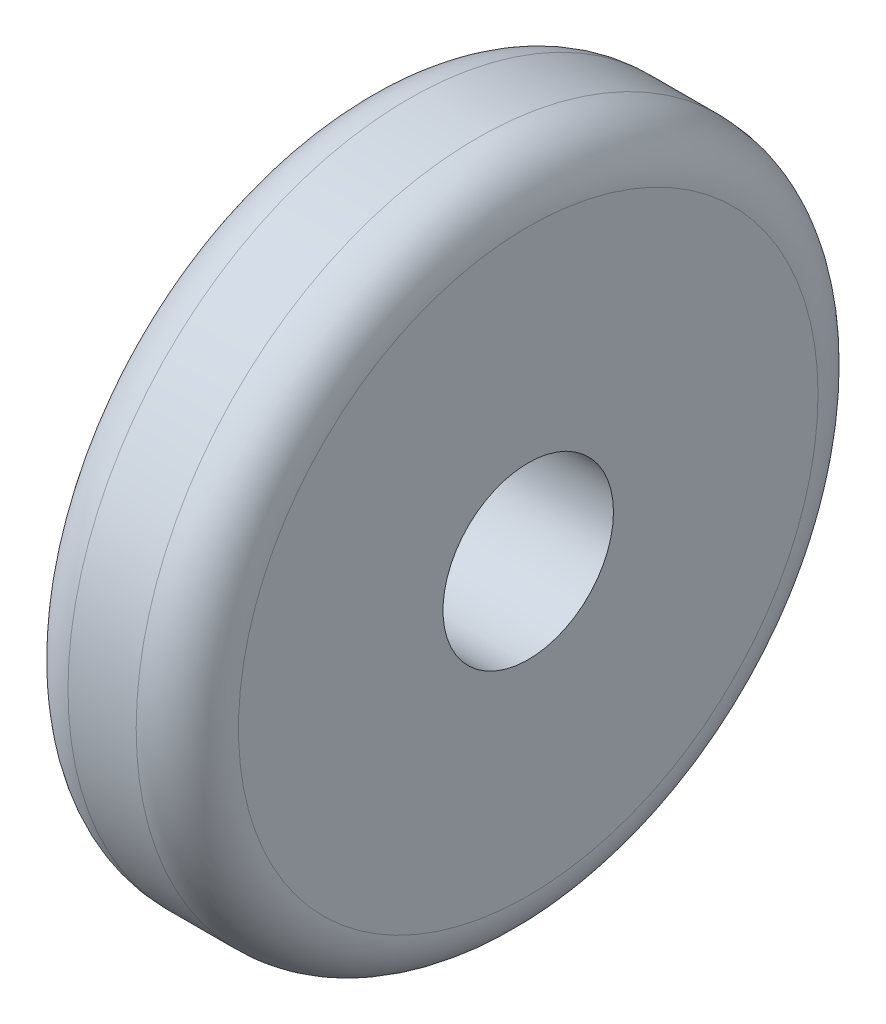
ISO-10303-21;
HEADER;
FILE_DESCRIPTION(('STEP AP214'),'2;1');
FILE_NAME('part.step','',(''),(''),'','','');
FILE_SCHEMA(('AUTOMOTIVE_DESIGN { 1 0 10303 214 1 1 1 1 }'));
ENDSEC;
DATA;
#1=APPLICATION_CONTEXT('core data for automotive mechanical design processes');
#2=APPLICATION_PROTOCOL_DEFINITION('international standard','automotive_design',2000,#1);
#3=PRODUCT_CONTEXT('',#1,'mechanical');
#4=PRODUCT('Part','Part','',(#3));
#5=PRODUCT_RELATED_PRODUCT_CATEGORY('part','',(#4));
#6=PRODUCT_DEFINITION_FORMATION('','',#4);
#7=PRODUCT_DEFINITION_CONTEXT('part definition',#1,'design');
#8=PRODUCT_DEFINITION('design','',#6,#7);
#9=PRODUCT_DEFINITION_SHAPE('','',#8);
#10=(LENGTH_UNIT() NAMED_UNIT(*) SI_UNIT(.MILLI.,.METRE.));
#11=(NAMED_UNIT(*) PLANE_ANGLE_UNIT() SI_UNIT($,.RADIAN.));
#12=(NAMED_UNIT(*) SI_UNIT($,.STERADIAN.) SOLID_ANGLE_UNIT());
#13=UNCERTAINTY_MEASURE_WITH_UNIT(LENGTH_MEASURE(1.E-05),#10,'distance_accuracy_value','');
#14=(GEOMETRIC_REPRESENTATION_CONTEXT(3) GLOBAL_UNCERTAINTY_ASSIGNED_CONTEXT((#13)) GLOBAL_UNIT_ASSIGNED_CONTEXT((#10,
#11,#12)) REPRESENTATION_CONTEXT('',''));
#15=CARTESIAN_POINT('',(0.,0.,0.));
#16=DIRECTION('',(0.,0.,1.));
#17=DIRECTION('',(1.,0.,0.));
#18=AXIS2_PLACEMENT_3D('',#15,#16,#17);
#19=CARTESIAN_POINT('',(5.,0.,0.));
#20=DIRECTION('',(1.,0.,0.));
#21=DIRECTION('',(0.,0.,-1.));
#22=AXIS2_PLACEMENT_3D('',#19,#20,#21);
#23=PLANE('',#22);
#24=CARTESIAN_POINT('',(5.,0.,0.));
#25=DIRECTION('',(1.,0.,0.));
#26=DIRECTION('',(0.,0.,-1.));
#27=AXIS2_PLACEMENT_3D('',#24,#25,#26);
#28=CIRCLE('',#27,17.);
#29=CARTESIAN_POINT('',(5.,0.,-17.));
#30=VERTEX_POINT('',#29);
#31=EDGE_CURVE('E10',#30,#30,#28,.T.);
#32=ORIENTED_EDGE('',*,*,#31,.T.);
#33=EDGE_LOOP('',(#32));
#34=FACE_BOUND('',#33,.T.);
#35=CARTESIAN_POINT('',(5.,0.,0.));
#36=DIRECTION('',(1.,0.,0.));
#37=DIRECTION('',(0.,0.,-1.));
#38=AXIS2_PLACEMENT_3D('',#35,#36,#37);
#39=CIRCLE('',#38,5.);
#40=CARTESIAN_POINT('',(5.,0.,-5.));
#41=VERTEX_POINT('',#40);
#42=EDGE_CURVE('E51',#41,#41,#39,.T.);
#43=ORIENTED_EDGE('',*,*,#42,.F.);
#44=EDGE_LOOP('',(#43));
#45=FACE_BOUND('',#44,.T.);
#46=ADVANCED_FACE('F31',(#34,#45),#23,.T.);
#47=CARTESIAN_POINT('',(-5.,0.,0.));
#48=DIRECTION('',(1.,0.,0.));
#49=DIRECTION('',(0.,0.,-1.));
#50=AXIS2_PLACEMENT_3D('',#47,#48,#49);
#51=PLANE('',#50);
#52=CARTESIAN_POINT('',(-5.,0.,0.));
#53=DIRECTION('',(1.,0.,0.));
#54=DIRECTION('',(0.,0.,-1.));
#55=AXIS2_PLACEMENT_3D('',#52,#53,#54);
#56=CIRCLE('',#55,17.);
#57=CARTESIAN_POINT('',(-5.,0.,-17.));
#58=VERTEX_POINT('',#57);
#59=EDGE_CURVE('E38',#58,#58,#56,.F.);
#60=ORIENTED_EDGE('',*,*,#59,.T.);
#61=EDGE_LOOP('',(#60));
#62=FACE_BOUND('',#61,.T.);
#63=CARTESIAN_POINT('',(-5.,0.,0.));
#64=DIRECTION('',(1.,0.,0.));
#65=DIRECTION('',(0.,0.,-1.));
#66=AXIS2_PLACEMENT_3D('',#63,#64,#65);
#67=CIRCLE('',#66,5.);
#68=CARTESIAN_POINT('',(-5.,0.,-5.));
#69=VERTEX_POINT('',#68);
#70=EDGE_CURVE('E52',#69,#69,#67,.T.);
#71=ORIENTED_EDGE('',*,*,#70,.T.);
#72=EDGE_LOOP('',(#71));
#73=FACE_BOUND('',#72,.T.);
#74=ADVANCED_FACE('F62',(#62,#73),#51,.F.);
#75=CARTESIAN_POINT('',(5.,0.,0.));
#76=DIRECTION('',(-1.,0.,0.));
#77=DIRECTION('',(0.,0.,1.));
#78=AXIS2_PLACEMENT_3D('',#75,#76,#77);
#79=CYLINDRICAL_SURFACE('',#78,20.);
#80=CARTESIAN_POINT('',(-2.,0.,0.));
#81=DIRECTION('',(1.,0.,0.));
#82=DIRECTION('',(0.,0.,-1.));
#83=AXIS2_PLACEMENT_3D('',#80,#81,#82);
#84=CIRCLE('',#83,20.);
#85=CARTESIAN_POINT('',(-2.,0.,-20.));
#86=VERTEX_POINT('',#85);
#87=EDGE_CURVE('E42',#86,#86,#84,.T.);
#88=ORIENTED_EDGE('',*,*,#87,.T.);
#89=EDGE_LOOP('',(#88));
#90=FACE_BOUND('',#89,.T.);
#91=CARTESIAN_POINT('',(2.,0.,0.));
#92=DIRECTION('',(1.,0.,0.));
#93=DIRECTION('',(0.,0.,-1.));
#94=AXIS2_PLACEMENT_3D('',#91,#92,#93);
#95=CIRCLE('',#94,20.);
#96=CARTESIAN_POINT('',(2.,0.,-20.));
#97=VERTEX_POINT('',#96);
#98=EDGE_CURVE('E46',#97,#97,#95,.F.);
#99=ORIENTED_EDGE('',*,*,#98,.T.);
#100=EDGE_LOOP('',(#99));
#101=FACE_BOUND('',#100,.T.);
#102=ADVANCED_FACE('F67',(#90,#101),#79,.T.);
#103=CARTESIAN_POINT('',(5.,0.,0.));
#104=DIRECTION('',(-1.,0.,0.));
#105=DIRECTION('',(0.,0.,1.));
#106=AXIS2_PLACEMENT_3D('',#103,#104,#105);
#107=CYLINDRICAL_SURFACE('',#106,5.);
#108=ORIENTED_EDGE('',*,*,#42,.T.);
#109=EDGE_LOOP('',(#108));
#110=FACE_BOUND('',#109,.T.);
#111=ORIENTED_EDGE('',*,*,#70,.F.);
#112=EDGE_LOOP('',(#111));
#113=FACE_BOUND('',#112,.T.);
#114=ADVANCED_FACE('F58',(#110,#113),#107,.F.);
#115=CARTESIAN_POINT('',(-2.,0.,0.));
#116=DIRECTION('',(1.,0.,0.));
#117=DIRECTION('',(0.,0.,-1.));
#118=AXIS2_PLACEMENT_3D('',#115,#116,#117);
#119=TOROIDAL_SURFACE('',#118,17.,3.);
#120=ORIENTED_EDGE('',*,*,#59,.F.);
#121=EDGE_LOOP('',(#120));
#122=FACE_BOUND('',#121,.T.);
#123=ORIENTED_EDGE('',*,*,#87,.F.);
#124=EDGE_LOOP('',(#123));
#125=FACE_BOUND('',#124,.T.);
#126=ADVANCED_FACE('F73',(#122,#125),#119,.T.);
#127=CARTESIAN_POINT('',(2.,0.,0.));
#128=DIRECTION('',(1.,0.,0.));
#129=DIRECTION('',(0.,0.,-1.));
#130=AXIS2_PLACEMENT_3D('',#127,#128,#129);
#131=TOROIDAL_SURFACE('',#130,17.,3.);
#132=ORIENTED_EDGE('',*,*,#98,.F.);
#133=EDGE_LOOP('',(#132));
#134=FACE_BOUND('',#133,.T.);
#135=ORIENTED_EDGE('',*,*,#31,.F.);
#136=EDGE_LOOP('',(#135));
#137=FACE_BOUND('',#136,.T.);
#138=ADVANCED_FACE('F33',(#134,#137),#131,.T.);
#139=CLOSED_SHELL('',(#46,#74,#102,#114,#126,#138));
#140=MANIFOLD_SOLID_BREP('B2',#139);
#141=ADVANCED_BREP_SHAPE_REPRESENTATION('',(#18,#140),#14);
#142=SHAPE_DEFINITION_REPRESENTATION(#9,#141);
ENDSEC;
END-ISO-10303-21;
